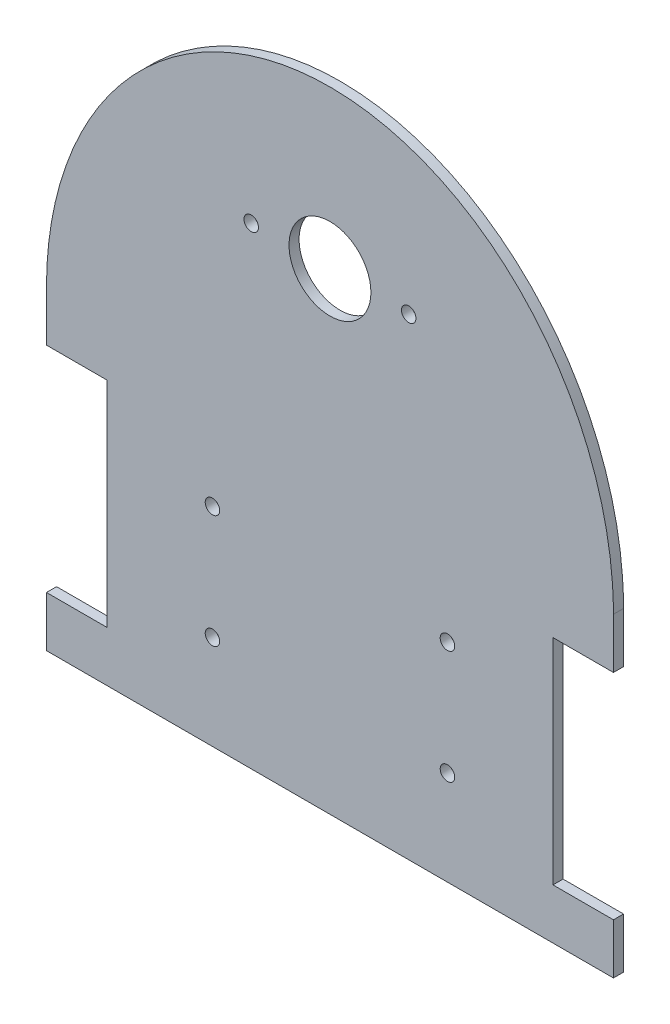
ISO-10303-21;
HEADER;
FILE_DESCRIPTION(('STEP AP214'),'2;1');
FILE_NAME('part.step','',(''),(''),'','','');
FILE_SCHEMA(('AUTOMOTIVE_DESIGN { 1 0 10303 214 1 1 1 1 }'));
ENDSEC;
DATA;
#1=APPLICATION_CONTEXT('core data for automotive mechanical design processes');
#2=APPLICATION_PROTOCOL_DEFINITION('international standard','automotive_design',2000,#1);
#3=PRODUCT_CONTEXT('',#1,'mechanical');
#4=PRODUCT('Part','Part','',(#3));
#5=PRODUCT_RELATED_PRODUCT_CATEGORY('part','',(#4));
#6=PRODUCT_DEFINITION_FORMATION('','',#4);
#7=PRODUCT_DEFINITION_CONTEXT('part definition',#1,'design');
#8=PRODUCT_DEFINITION('design','',#6,#7);
#9=PRODUCT_DEFINITION_SHAPE('','',#8);
#10=(LENGTH_UNIT() NAMED_UNIT(*) SI_UNIT(.MILLI.,.METRE.));
#11=(NAMED_UNIT(*) PLANE_ANGLE_UNIT() SI_UNIT($,.RADIAN.));
#12=(NAMED_UNIT(*) SI_UNIT($,.STERADIAN.) SOLID_ANGLE_UNIT());
#13=UNCERTAINTY_MEASURE_WITH_UNIT(LENGTH_MEASURE(1.E-05),#10,'distance_accuracy_value','');
#14=(GEOMETRIC_REPRESENTATION_CONTEXT(3) GLOBAL_UNCERTAINTY_ASSIGNED_CONTEXT((#13)) GLOBAL_UNIT_ASSIGNED_CONTEXT((#10,
#11,#12)) REPRESENTATION_CONTEXT('',''));
#15=CARTESIAN_POINT('',(0.,0.,0.));
#16=DIRECTION('',(0.,0.,1.));
#17=DIRECTION('',(1.,0.,0.));
#18=AXIS2_PLACEMENT_3D('',#15,#16,#17);
#19=CARTESIAN_POINT('',(-45.,-50.,1.6));
#20=DIRECTION('',(1.,0.,0.));
#21=DIRECTION('',(0.,0.,-1.));
#22=AXIS2_PLACEMENT_3D('',#19,#20,#21);
#23=PLANE('',#22);
#24=DIRECTION('',(0.,-1.,0.));
#25=VECTOR('',#24,1.);
#26=CARTESIAN_POINT('',(-45.,-50.,0.));
#27=LINE('',#26,#25);
#28=CARTESIAN_POINT('',(-45.,0.,0.));
#29=VERTEX_POINT('',#28);
#30=CARTESIAN_POINT('',(-45.,-7.99999999999999,0.));
#31=VERTEX_POINT('',#30);
#32=EDGE_CURVE('E235',#29,#31,#27,.T.);
#33=ORIENTED_EDGE('',*,*,#32,.T.);
#34=DIRECTION('',(0.,0.,1.));
#35=VECTOR('',#34,1.);
#36=CARTESIAN_POINT('',(-45.,-7.99999999999999,0.));
#37=LINE('',#36,#35);
#38=CARTESIAN_POINT('',(-45.,-7.99999999999999,1.6));
#39=VERTEX_POINT('',#38);
#40=EDGE_CURVE('E167',#31,#39,#37,.T.);
#41=ORIENTED_EDGE('',*,*,#40,.T.);
#42=DIRECTION('',(0.,-1.,0.));
#43=VECTOR('',#42,1.);
#44=CARTESIAN_POINT('',(-45.,-50.,1.6));
#45=LINE('',#44,#43);
#46=CARTESIAN_POINT('',(-45.,0.,1.6));
#47=VERTEX_POINT('',#46);
#48=EDGE_CURVE('E271',#47,#39,#45,.T.);
#49=ORIENTED_EDGE('',*,*,#48,.F.);
#50=DIRECTION('',(0.,0.,1.));
#51=VECTOR('',#50,1.);
#52=CARTESIAN_POINT('',(-45.,0.,0.));
#53=LINE('',#52,#51);
#54=EDGE_CURVE('E238',#29,#47,#53,.T.);
#55=ORIENTED_EDGE('',*,*,#54,.F.);
#56=EDGE_LOOP('',(#33,#41,#49,#55));
#57=FACE_BOUND('',#56,.T.);
#58=ADVANCED_FACE('F45',(#57),#23,.F.);
#59=CARTESIAN_POINT('',(45.,-50.,1.6));
#60=DIRECTION('',(-1.,0.,0.));
#61=DIRECTION('',(0.,0.,1.));
#62=AXIS2_PLACEMENT_3D('',#59,#60,#61);
#63=PLANE('',#62);
#64=DIRECTION('',(0.,1.,0.));
#65=VECTOR('',#64,1.);
#66=CARTESIAN_POINT('',(45.,-50.,0.));
#67=LINE('',#66,#65);
#68=CARTESIAN_POINT('',(45.,-50.,0.));
#69=VERTEX_POINT('',#68);
#70=CARTESIAN_POINT('',(45.,-42.,0.));
#71=VERTEX_POINT('',#70);
#72=EDGE_CURVE('E248',#69,#71,#67,.T.);
#73=ORIENTED_EDGE('',*,*,#72,.T.);
#74=DIRECTION('',(0.,0.,1.));
#75=VECTOR('',#74,1.);
#76=CARTESIAN_POINT('',(45.,-42.,0.));
#77=LINE('',#76,#75);
#78=CARTESIAN_POINT('',(45.,-42.,1.6));
#79=VERTEX_POINT('',#78);
#80=EDGE_CURVE('E180',#71,#79,#77,.T.);
#81=ORIENTED_EDGE('',*,*,#80,.T.);
#82=DIRECTION('',(0.,1.,0.));
#83=VECTOR('',#82,1.);
#84=CARTESIAN_POINT('',(45.,-50.,1.6));
#85=LINE('',#84,#83);
#86=CARTESIAN_POINT('',(45.,-50.,1.6));
#87=VERTEX_POINT('',#86);
#88=EDGE_CURVE('E245',#87,#79,#85,.T.);
#89=ORIENTED_EDGE('',*,*,#88,.F.);
#90=DIRECTION('',(0.,0.,-1.));
#91=VECTOR('',#90,1.);
#92=CARTESIAN_POINT('',(45.,-50.,1.6));
#93=LINE('',#92,#91);
#94=EDGE_CURVE('E252',#87,#69,#93,.T.);
#95=ORIENTED_EDGE('',*,*,#94,.T.);
#96=EDGE_LOOP('',(#73,#81,#89,#95));
#97=FACE_BOUND('',#96,.T.);
#98=ADVANCED_FACE('F212',(#97),#63,.F.);
#99=CARTESIAN_POINT('',(0.,0.,1.6));
#100=DIRECTION('',(0.,0.,1.));
#101=DIRECTION('',(1.,0.,0.));
#102=AXIS2_PLACEMENT_3D('',#99,#100,#101);
#103=PLANE('',#102);
#104=CARTESIAN_POINT('',(-12.5,25.,1.6));
#105=DIRECTION('',(0.,0.,1.));
#106=DIRECTION('',(1.,0.,0.));
#107=AXIS2_PLACEMENT_3D('',#104,#105,#106);
#108=CIRCLE('',#107,1.15);
#109=CARTESIAN_POINT('',(-11.35,25.,1.6));
#110=VERTEX_POINT('',#109);
#111=EDGE_CURVE('E333',#110,#110,#108,.T.);
#112=ORIENTED_EDGE('',*,*,#111,.F.);
#113=EDGE_LOOP('',(#112));
#114=FACE_BOUND('',#113,.T.);
#115=CARTESIAN_POINT('',(12.5,25.,1.6));
#116=DIRECTION('',(0.,0.,1.));
#117=DIRECTION('',(1.,0.,0.));
#118=AXIS2_PLACEMENT_3D('',#115,#116,#117);
#119=CIRCLE('',#118,1.15);
#120=CARTESIAN_POINT('',(13.65,25.,1.6));
#121=VERTEX_POINT('',#120);
#122=EDGE_CURVE('E334',#121,#121,#119,.T.);
#123=ORIENTED_EDGE('',*,*,#122,.F.);
#124=EDGE_LOOP('',(#123));
#125=FACE_BOUND('',#124,.T.);
#126=CARTESIAN_POINT('',(18.65,-17.,1.6));
#127=DIRECTION('',(0.,0.,1.));
#128=DIRECTION('',(-1.,0.,0.));
#129=AXIS2_PLACEMENT_3D('',#126,#127,#128);
#130=CIRCLE('',#129,1.15);
#131=CARTESIAN_POINT('',(17.5,-17.,1.6));
#132=VERTEX_POINT('',#131);
#133=EDGE_CURVE('E357',#132,#132,#130,.T.);
#134=ORIENTED_EDGE('',*,*,#133,.F.);
#135=EDGE_LOOP('',(#134));
#136=FACE_BOUND('',#135,.T.);
#137=CARTESIAN_POINT('',(18.65,-35.,1.6));
#138=DIRECTION('',(0.,0.,1.));
#139=DIRECTION('',(-1.,0.,0.));
#140=AXIS2_PLACEMENT_3D('',#137,#138,#139);
#141=CIRCLE('',#140,1.15);
#142=CARTESIAN_POINT('',(17.5,-35.,1.6));
#143=VERTEX_POINT('',#142);
#144=EDGE_CURVE('E351',#143,#143,#141,.T.);
#145=ORIENTED_EDGE('',*,*,#144,.F.);
#146=EDGE_LOOP('',(#145));
#147=FACE_BOUND('',#146,.T.);
#148=CARTESIAN_POINT('',(-18.65,-35.,1.6));
#149=DIRECTION('',(0.,0.,1.));
#150=DIRECTION('',(1.,0.,0.));
#151=AXIS2_PLACEMENT_3D('',#148,#149,#150);
#152=CIRCLE('',#151,1.15);
#153=CARTESIAN_POINT('',(-17.5,-35.,1.6));
#154=VERTEX_POINT('',#153);
#155=EDGE_CURVE('E344',#154,#154,#152,.T.);
#156=ORIENTED_EDGE('',*,*,#155,.F.);
#157=EDGE_LOOP('',(#156));
#158=FACE_BOUND('',#157,.T.);
#159=CARTESIAN_POINT('',(-18.65,-17.,1.6));
#160=DIRECTION('',(0.,0.,1.));
#161=DIRECTION('',(1.,0.,0.));
#162=AXIS2_PLACEMENT_3D('',#159,#160,#161);
#163=CIRCLE('',#162,1.15);
#164=CARTESIAN_POINT('',(-17.5,-17.,1.6));
#165=VERTEX_POINT('',#164);
#166=EDGE_CURVE('E347',#165,#165,#163,.T.);
#167=ORIENTED_EDGE('',*,*,#166,.F.);
#168=EDGE_LOOP('',(#167));
#169=FACE_BOUND('',#168,.T.);
#170=CARTESIAN_POINT('',(0.,25.,1.6));
#171=DIRECTION('',(0.,0.,1.));
#172=DIRECTION('',(1.,0.,0.));
#173=AXIS2_PLACEMENT_3D('',#170,#171,#172);
#174=CIRCLE('',#173,6.5);
#175=CARTESIAN_POINT('',(6.5,25.,1.6));
#176=VERTEX_POINT('',#175);
#177=EDGE_CURVE('E160',#176,#176,#174,.T.);
#178=ORIENTED_EDGE('',*,*,#177,.F.);
#179=EDGE_LOOP('',(#178));
#180=FACE_BOUND('',#179,.T.);
#181=DIRECTION('',(-1.,0.,0.));
#182=VECTOR('',#181,1.);
#183=CARTESIAN_POINT('',(-45.,-7.99999999999999,1.6));
#184=LINE('',#183,#182);
#185=CARTESIAN_POINT('',(-35.4,-7.99999999999999,1.6));
#186=VERTEX_POINT('',#185);
#187=EDGE_CURVE('E155',#186,#39,#184,.T.);
#188=ORIENTED_EDGE('',*,*,#187,.F.);
#189=DIRECTION('',(0.,1.,0.));
#190=VECTOR('',#189,1.);
#191=CARTESIAN_POINT('',(-35.4,-7.99999999999999,1.6));
#192=LINE('',#191,#190);
#193=CARTESIAN_POINT('',(-35.4,-42.,1.6));
#194=VERTEX_POINT('',#193);
#195=EDGE_CURVE('E157',#194,#186,#192,.T.);
#196=ORIENTED_EDGE('',*,*,#195,.F.);
#197=DIRECTION('',(1.,0.,0.));
#198=VECTOR('',#197,1.);
#199=CARTESIAN_POINT('',(-45.,-42.,1.6));
#200=LINE('',#199,#198);
#201=CARTESIAN_POINT('',(-45.,-42.,1.6));
#202=VERTEX_POINT('',#201);
#203=EDGE_CURVE('E136',#202,#194,#200,.T.);
#204=ORIENTED_EDGE('',*,*,#203,.F.);
#205=CARTESIAN_POINT('',(-45.,-50.,1.6));
#206=VERTEX_POINT('',#205);
#207=EDGE_CURVE('E251',#202,#206,#45,.T.);
#208=ORIENTED_EDGE('',*,*,#207,.T.);
#209=DIRECTION('',(1.,0.,0.));
#210=VECTOR('',#209,1.);
#211=CARTESIAN_POINT('',(45.,-50.,1.6));
#212=LINE('',#211,#210);
#213=EDGE_CURVE('E258',#206,#87,#212,.T.);
#214=ORIENTED_EDGE('',*,*,#213,.T.);
#215=ORIENTED_EDGE('',*,*,#88,.T.);
#216=DIRECTION('',(1.,0.,0.));
#217=VECTOR('',#216,1.);
#218=CARTESIAN_POINT('',(45.,-42.,1.6));
#219=LINE('',#218,#217);
#220=CARTESIAN_POINT('',(35.4,-42.,1.6));
#221=VERTEX_POINT('',#220);
#222=EDGE_CURVE('E184',#221,#79,#219,.T.);
#223=ORIENTED_EDGE('',*,*,#222,.F.);
#224=DIRECTION('',(0.,-1.,0.));
#225=VECTOR('',#224,1.);
#226=CARTESIAN_POINT('',(35.4,-7.99999999999999,1.6));
#227=LINE('',#226,#225);
#228=CARTESIAN_POINT('',(35.4,-7.99999999999999,1.6));
#229=VERTEX_POINT('',#228);
#230=EDGE_CURVE('E186',#229,#221,#227,.T.);
#231=ORIENTED_EDGE('',*,*,#230,.F.);
#232=DIRECTION('',(-1.,0.,0.));
#233=VECTOR('',#232,1.);
#234=CARTESIAN_POINT('',(45.,-7.99999999999999,1.6));
#235=LINE('',#234,#233);
#236=CARTESIAN_POINT('',(45.,-7.99999999999999,1.6));
#237=VERTEX_POINT('',#236);
#238=EDGE_CURVE('E165',#237,#229,#235,.T.);
#239=ORIENTED_EDGE('',*,*,#238,.F.);
#240=CARTESIAN_POINT('',(45.,0.,1.6));
#241=VERTEX_POINT('',#240);
#242=EDGE_CURVE('E266',#237,#241,#85,.T.);
#243=ORIENTED_EDGE('',*,*,#242,.T.);
#244=CARTESIAN_POINT('',(0.,0.,1.6));
#245=DIRECTION('',(0.,0.,-1.));
#246=DIRECTION('',(0.,-1.,0.));
#247=AXIS2_PLACEMENT_3D('',#244,#245,#246);
#248=ELLIPSE('',#247,50.,45.);
#249=EDGE_CURVE('E170',#47,#241,#248,.T.);
#250=ORIENTED_EDGE('',*,*,#249,.F.);
#251=ORIENTED_EDGE('',*,*,#48,.T.);
#252=EDGE_LOOP('',(#188,#196,#204,#208,#214,#215,#223,#231,#239,#243,#250,#251));
#253=FACE_BOUND('',#252,.T.);
#254=ADVANCED_FACE('F209',(#114,#125,#136,#147,#158,#169,#180,#253),#103,.T.);
#255=CARTESIAN_POINT('',(0.,0.,0.));
#256=DIRECTION('',(0.,0.,1.));
#257=DIRECTION('',(1.,0.,0.));
#258=AXIS2_PLACEMENT_3D('',#255,#256,#257);
#259=PLANE('',#258);
#260=CARTESIAN_POINT('',(-12.5,25.,0.));
#261=DIRECTION('',(0.,0.,1.));
#262=DIRECTION('',(1.,0.,0.));
#263=AXIS2_PLACEMENT_3D('',#260,#261,#262);
#264=CIRCLE('',#263,1.15);
#265=CARTESIAN_POINT('',(-11.35,25.,0.));
#266=VERTEX_POINT('',#265);
#267=EDGE_CURVE('E330',#266,#266,#264,.T.);
#268=ORIENTED_EDGE('',*,*,#267,.T.);
#269=EDGE_LOOP('',(#268));
#270=FACE_BOUND('',#269,.T.);
#271=CARTESIAN_POINT('',(12.5,25.,0.));
#272=DIRECTION('',(0.,0.,1.));
#273=DIRECTION('',(1.,0.,0.));
#274=AXIS2_PLACEMENT_3D('',#271,#272,#273);
#275=CIRCLE('',#274,1.15);
#276=CARTESIAN_POINT('',(13.65,25.,0.));
#277=VERTEX_POINT('',#276);
#278=EDGE_CURVE('E339',#277,#277,#275,.T.);
#279=ORIENTED_EDGE('',*,*,#278,.T.);
#280=EDGE_LOOP('',(#279));
#281=FACE_BOUND('',#280,.T.);
#282=CARTESIAN_POINT('',(18.65,-17.,0.));
#283=DIRECTION('',(0.,0.,1.));
#284=DIRECTION('',(-1.,0.,0.));
#285=AXIS2_PLACEMENT_3D('',#282,#283,#284);
#286=CIRCLE('',#285,1.15);
#287=CARTESIAN_POINT('',(17.5,-17.,0.));
#288=VERTEX_POINT('',#287);
#289=EDGE_CURVE('E336',#288,#288,#286,.T.);
#290=ORIENTED_EDGE('',*,*,#289,.T.);
#291=EDGE_LOOP('',(#290));
#292=FACE_BOUND('',#291,.T.);
#293=CARTESIAN_POINT('',(18.65,-35.,0.));
#294=DIRECTION('',(0.,0.,1.));
#295=DIRECTION('',(-1.,0.,0.));
#296=AXIS2_PLACEMENT_3D('',#293,#294,#295);
#297=CIRCLE('',#296,1.15);
#298=CARTESIAN_POINT('',(17.5,-35.,0.));
#299=VERTEX_POINT('',#298);
#300=EDGE_CURVE('E354',#299,#299,#297,.T.);
#301=ORIENTED_EDGE('',*,*,#300,.T.);
#302=EDGE_LOOP('',(#301));
#303=FACE_BOUND('',#302,.T.);
#304=CARTESIAN_POINT('',(-18.65,-35.,0.));
#305=DIRECTION('',(0.,0.,1.));
#306=DIRECTION('',(1.,0.,0.));
#307=AXIS2_PLACEMENT_3D('',#304,#305,#306);
#308=CIRCLE('',#307,1.15);
#309=CARTESIAN_POINT('',(-17.5,-35.,0.));
#310=VERTEX_POINT('',#309);
#311=EDGE_CURVE('E348',#310,#310,#308,.T.);
#312=ORIENTED_EDGE('',*,*,#311,.T.);
#313=EDGE_LOOP('',(#312));
#314=FACE_BOUND('',#313,.T.);
#315=CARTESIAN_POINT('',(-18.65,-17.,0.));
#316=DIRECTION('',(0.,0.,1.));
#317=DIRECTION('',(1.,0.,0.));
#318=AXIS2_PLACEMENT_3D('',#315,#316,#317);
#319=CIRCLE('',#318,1.15);
#320=CARTESIAN_POINT('',(-17.5,-17.,0.));
#321=VERTEX_POINT('',#320);
#322=EDGE_CURVE('E362',#321,#321,#319,.T.);
#323=ORIENTED_EDGE('',*,*,#322,.T.);
#324=EDGE_LOOP('',(#323));
#325=FACE_BOUND('',#324,.T.);
#326=CARTESIAN_POINT('',(0.,25.,0.));
#327=DIRECTION('',(0.,0.,1.));
#328=DIRECTION('',(1.,0.,0.));
#329=AXIS2_PLACEMENT_3D('',#326,#327,#328);
#330=CIRCLE('',#329,6.5);
#331=CARTESIAN_POINT('',(6.5,25.,0.));
#332=VERTEX_POINT('',#331);
#333=EDGE_CURVE('E183',#332,#332,#330,.T.);
#334=ORIENTED_EDGE('',*,*,#333,.T.);
#335=EDGE_LOOP('',(#334));
#336=FACE_BOUND('',#335,.T.);
#337=DIRECTION('',(0.,1.,0.));
#338=VECTOR('',#337,1.);
#339=CARTESIAN_POINT('',(-35.4,-7.99999999999999,0.));
#340=LINE('',#339,#338);
#341=CARTESIAN_POINT('',(-35.4,-42.,0.));
#342=VERTEX_POINT('',#341);
#343=CARTESIAN_POINT('',(-35.4,-7.99999999999999,0.));
#344=VERTEX_POINT('',#343);
#345=EDGE_CURVE('E144',#342,#344,#340,.T.);
#346=ORIENTED_EDGE('',*,*,#345,.T.);
#347=DIRECTION('',(-1.,0.,0.));
#348=VECTOR('',#347,1.);
#349=CARTESIAN_POINT('',(-45.,-7.99999999999999,0.));
#350=LINE('',#349,#348);
#351=EDGE_CURVE('E149',#344,#31,#350,.T.);
#352=ORIENTED_EDGE('',*,*,#351,.T.);
#353=ORIENTED_EDGE('',*,*,#32,.F.);
#354=CARTESIAN_POINT('',(0.,0.,0.));
#355=DIRECTION('',(0.,0.,-1.));
#356=DIRECTION('',(0.,-1.,0.));
#357=AXIS2_PLACEMENT_3D('',#354,#355,#356);
#358=ELLIPSE('',#357,50.,45.);
#359=CARTESIAN_POINT('',(45.,0.,0.));
#360=VERTEX_POINT('',#359);
#361=EDGE_CURVE('E11',#29,#360,#358,.T.);
#362=ORIENTED_EDGE('',*,*,#361,.T.);
#363=CARTESIAN_POINT('',(45.,-7.99999999999999,0.));
#364=VERTEX_POINT('',#363);
#365=EDGE_CURVE('E241',#364,#360,#67,.T.);
#366=ORIENTED_EDGE('',*,*,#365,.F.);
#367=DIRECTION('',(-1.,0.,0.));
#368=VECTOR('',#367,1.);
#369=CARTESIAN_POINT('',(45.,-7.99999999999999,0.));
#370=LINE('',#369,#368);
#371=CARTESIAN_POINT('',(35.4,-7.99999999999999,0.));
#372=VERTEX_POINT('',#371);
#373=EDGE_CURVE('E68',#364,#372,#370,.T.);
#374=ORIENTED_EDGE('',*,*,#373,.T.);
#375=DIRECTION('',(0.,-1.,0.));
#376=VECTOR('',#375,1.);
#377=CARTESIAN_POINT('',(35.4,-7.99999999999999,0.));
#378=LINE('',#377,#376);
#379=CARTESIAN_POINT('',(35.4,-42.,0.));
#380=VERTEX_POINT('',#379);
#381=EDGE_CURVE('E193',#372,#380,#378,.T.);
#382=ORIENTED_EDGE('',*,*,#381,.T.);
#383=DIRECTION('',(1.,0.,0.));
#384=VECTOR('',#383,1.);
#385=CARTESIAN_POINT('',(45.,-42.,0.));
#386=LINE('',#385,#384);
#387=EDGE_CURVE('E175',#380,#71,#386,.T.);
#388=ORIENTED_EDGE('',*,*,#387,.T.);
#389=ORIENTED_EDGE('',*,*,#72,.F.);
#390=DIRECTION('',(1.,0.,0.));
#391=VECTOR('',#390,1.);
#392=CARTESIAN_POINT('',(45.,-50.,0.));
#393=LINE('',#392,#391);
#394=CARTESIAN_POINT('',(-45.,-50.,0.));
#395=VERTEX_POINT('',#394);
#396=EDGE_CURVE('E239',#395,#69,#393,.T.);
#397=ORIENTED_EDGE('',*,*,#396,.F.);
#398=CARTESIAN_POINT('',(-45.,-42.,0.));
#399=VERTEX_POINT('',#398);
#400=EDGE_CURVE('E154',#399,#395,#27,.T.);
#401=ORIENTED_EDGE('',*,*,#400,.F.);
#402=DIRECTION('',(1.,0.,0.));
#403=VECTOR('',#402,1.);
#404=CARTESIAN_POINT('',(-45.,-42.,0.));
#405=LINE('',#404,#403);
#406=EDGE_CURVE('E60',#399,#342,#405,.T.);
#407=ORIENTED_EDGE('',*,*,#406,.T.);
#408=EDGE_LOOP('',(#346,#352,#353,#362,#366,#374,#382,#388,#389,#397,#401,#407));
#409=FACE_BOUND('',#408,.T.);
#410=ADVANCED_FACE('F152',(#270,#281,#292,#303,#314,#325,#336,#409),#259,.F.);
#411=ORIENTED_EDGE('',*,*,#207,.F.);
#412=DIRECTION('',(0.,0.,1.));
#413=VECTOR('',#412,1.);
#414=CARTESIAN_POINT('',(-45.,-42.,0.));
#415=LINE('',#414,#413);
#416=EDGE_CURVE('E141',#399,#202,#415,.T.);
#417=ORIENTED_EDGE('',*,*,#416,.F.);
#418=ORIENTED_EDGE('',*,*,#400,.T.);
#419=DIRECTION('',(0.,0.,-1.));
#420=VECTOR('',#419,1.);
#421=CARTESIAN_POINT('',(-45.,-50.,1.6));
#422=LINE('',#421,#420);
#423=EDGE_CURVE('E53',#206,#395,#422,.T.);
#424=ORIENTED_EDGE('',*,*,#423,.F.);
#425=EDGE_LOOP('',(#411,#417,#418,#424));
#426=FACE_BOUND('',#425,.T.);
#427=ADVANCED_FACE('F47',(#426),#23,.F.);
#428=CARTESIAN_POINT('',(45.,-50.,1.6));
#429=DIRECTION('',(0.,1.,0.));
#430=DIRECTION('',(-1.,0.,0.));
#431=AXIS2_PLACEMENT_3D('',#428,#429,#430);
#432=PLANE('',#431);
#433=ORIENTED_EDGE('',*,*,#396,.T.);
#434=ORIENTED_EDGE('',*,*,#94,.F.);
#435=ORIENTED_EDGE('',*,*,#213,.F.);
#436=ORIENTED_EDGE('',*,*,#423,.T.);
#437=EDGE_LOOP('',(#433,#434,#435,#436));
#438=FACE_BOUND('',#437,.T.);
#439=ADVANCED_FACE('F218',(#438),#432,.F.);
#440=ORIENTED_EDGE('',*,*,#242,.F.);
#441=DIRECTION('',(0.,0.,1.));
#442=VECTOR('',#441,1.);
#443=CARTESIAN_POINT('',(45.,-7.99999999999999,0.));
#444=LINE('',#443,#442);
#445=EDGE_CURVE('E173',#364,#237,#444,.T.);
#446=ORIENTED_EDGE('',*,*,#445,.F.);
#447=ORIENTED_EDGE('',*,*,#365,.T.);
#448=DIRECTION('',(0.,0.,1.));
#449=VECTOR('',#448,1.);
#450=CARTESIAN_POINT('',(45.,0.,0.));
#451=LINE('',#450,#449);
#452=EDGE_CURVE('E243',#360,#241,#451,.T.);
#453=ORIENTED_EDGE('',*,*,#452,.T.);
#454=EDGE_LOOP('',(#440,#446,#447,#453));
#455=FACE_BOUND('',#454,.T.);
#456=ADVANCED_FACE('F206',(#455),#63,.F.);
#457=CARTESIAN_POINT('',(0.,0.,0.));
#458=DIRECTION('',(0.,0.,-1.));
#459=DIRECTION('',(0.,-1.,0.));
#460=AXIS2_PLACEMENT_3D('',#457,#458,#459);
#461=ELLIPSE('',#460,50.,45.);
#462=DIRECTION('',(0.,0.,1.));
#463=VECTOR('',#462,1.);
#464=SURFACE_OF_LINEAR_EXTRUSION('',#461,#463);
#465=ORIENTED_EDGE('',*,*,#361,.F.);
#466=ORIENTED_EDGE('',*,*,#54,.T.);
#467=ORIENTED_EDGE('',*,*,#249,.T.);
#468=ORIENTED_EDGE('',*,*,#452,.F.);
#469=EDGE_LOOP('',(#465,#466,#467,#468));
#470=FACE_BOUND('',#469,.T.);
#471=ADVANCED_FACE('F201',(#470),#464,.F.);
#472=CARTESIAN_POINT('',(45.,-42.,0.));
#473=DIRECTION('',(0.,-1.,0.));
#474=DIRECTION('',(0.,0.,-1.));
#475=AXIS2_PLACEMENT_3D('',#472,#473,#474);
#476=PLANE('',#475);
#477=ORIENTED_EDGE('',*,*,#222,.T.);
#478=ORIENTED_EDGE('',*,*,#80,.F.);
#479=ORIENTED_EDGE('',*,*,#387,.F.);
#480=DIRECTION('',(0.,0.,1.));
#481=VECTOR('',#480,1.);
#482=CARTESIAN_POINT('',(35.4,-42.,0.));
#483=LINE('',#482,#481);
#484=EDGE_CURVE('E178',#380,#221,#483,.T.);
#485=ORIENTED_EDGE('',*,*,#484,.T.);
#486=EDGE_LOOP('',(#477,#478,#479,#485));
#487=FACE_BOUND('',#486,.T.);
#488=ADVANCED_FACE('F205',(#487),#476,.F.);
#489=CARTESIAN_POINT('',(35.4,-7.99999999999999,0.));
#490=DIRECTION('',(-1.,0.,0.));
#491=DIRECTION('',(0.,-1.,0.));
#492=AXIS2_PLACEMENT_3D('',#489,#490,#491);
#493=PLANE('',#492);
#494=ORIENTED_EDGE('',*,*,#230,.T.);
#495=ORIENTED_EDGE('',*,*,#484,.F.);
#496=ORIENTED_EDGE('',*,*,#381,.F.);
#497=DIRECTION('',(0.,0.,1.));
#498=VECTOR('',#497,1.);
#499=CARTESIAN_POINT('',(35.4,-7.99999999999999,0.));
#500=LINE('',#499,#498);
#501=EDGE_CURVE('E176',#372,#229,#500,.T.);
#502=ORIENTED_EDGE('',*,*,#501,.T.);
#503=EDGE_LOOP('',(#494,#495,#496,#502));
#504=FACE_BOUND('',#503,.T.);
#505=ADVANCED_FACE('F279',(#504),#493,.F.);
#506=CARTESIAN_POINT('',(45.,-7.99999999999999,0.));
#507=DIRECTION('',(0.,1.,0.));
#508=DIRECTION('',(0.,0.,1.));
#509=AXIS2_PLACEMENT_3D('',#506,#507,#508);
#510=PLANE('',#509);
#511=ORIENTED_EDGE('',*,*,#238,.T.);
#512=ORIENTED_EDGE('',*,*,#501,.F.);
#513=ORIENTED_EDGE('',*,*,#373,.F.);
#514=ORIENTED_EDGE('',*,*,#445,.T.);
#515=EDGE_LOOP('',(#511,#512,#513,#514));
#516=FACE_BOUND('',#515,.T.);
#517=ADVANCED_FACE('F283',(#516),#510,.F.);
#518=CARTESIAN_POINT('',(-45.,-7.99999999999999,0.));
#519=DIRECTION('',(0.,1.,0.));
#520=DIRECTION('',(0.,0.,1.));
#521=AXIS2_PLACEMENT_3D('',#518,#519,#520);
#522=PLANE('',#521);
#523=ORIENTED_EDGE('',*,*,#187,.T.);
#524=ORIENTED_EDGE('',*,*,#40,.F.);
#525=ORIENTED_EDGE('',*,*,#351,.F.);
#526=DIRECTION('',(0.,0.,1.));
#527=VECTOR('',#526,1.);
#528=CARTESIAN_POINT('',(-35.4,-7.99999999999999,0.));
#529=LINE('',#528,#527);
#530=EDGE_CURVE('E140',#344,#186,#529,.T.);
#531=ORIENTED_EDGE('',*,*,#530,.T.);
#532=EDGE_LOOP('',(#523,#524,#525,#531));
#533=FACE_BOUND('',#532,.T.);
#534=ADVANCED_FACE('F285',(#533),#522,.F.);
#535=CARTESIAN_POINT('',(-35.4,-7.99999999999999,0.));
#536=DIRECTION('',(1.,0.,0.));
#537=DIRECTION('',(0.,1.,0.));
#538=AXIS2_PLACEMENT_3D('',#535,#536,#537);
#539=PLANE('',#538);
#540=ORIENTED_EDGE('',*,*,#195,.T.);
#541=ORIENTED_EDGE('',*,*,#530,.F.);
#542=ORIENTED_EDGE('',*,*,#345,.F.);
#543=DIRECTION('',(0.,0.,1.));
#544=VECTOR('',#543,1.);
#545=CARTESIAN_POINT('',(-35.4,-42.,0.));
#546=LINE('',#545,#544);
#547=EDGE_CURVE('E132',#342,#194,#546,.T.);
#548=ORIENTED_EDGE('',*,*,#547,.T.);
#549=EDGE_LOOP('',(#540,#541,#542,#548));
#550=FACE_BOUND('',#549,.T.);
#551=ADVANCED_FACE('F145',(#550),#539,.F.);
#552=CARTESIAN_POINT('',(-45.,-42.,0.));
#553=DIRECTION('',(0.,-1.,0.));
#554=DIRECTION('',(0.,0.,-1.));
#555=AXIS2_PLACEMENT_3D('',#552,#553,#554);
#556=PLANE('',#555);
#557=ORIENTED_EDGE('',*,*,#203,.T.);
#558=ORIENTED_EDGE('',*,*,#547,.F.);
#559=ORIENTED_EDGE('',*,*,#406,.F.);
#560=ORIENTED_EDGE('',*,*,#416,.T.);
#561=EDGE_LOOP('',(#557,#558,#559,#560));
#562=FACE_BOUND('',#561,.T.);
#563=ADVANCED_FACE('F134',(#562),#556,.F.);
#564=CARTESIAN_POINT('',(0.,25.,0.));
#565=DIRECTION('',(0.,0.,1.));
#566=DIRECTION('',(1.,0.,0.));
#567=AXIS2_PLACEMENT_3D('',#564,#565,#566);
#568=CYLINDRICAL_SURFACE('',#567,6.5);
#569=ORIENTED_EDGE('',*,*,#333,.F.);
#570=EDGE_LOOP('',(#569));
#571=FACE_BOUND('',#570,.T.);
#572=ORIENTED_EDGE('',*,*,#177,.T.);
#573=EDGE_LOOP('',(#572));
#574=FACE_BOUND('',#573,.T.);
#575=ADVANCED_FACE('F296',(#571,#574),#568,.F.);
#576=CARTESIAN_POINT('',(-18.65,-17.,0.));
#577=DIRECTION('',(0.,0.,1.));
#578=DIRECTION('',(1.,0.,0.));
#579=AXIS2_PLACEMENT_3D('',#576,#577,#578);
#580=CYLINDRICAL_SURFACE('',#579,1.15);
#581=ORIENTED_EDGE('',*,*,#322,.F.);
#582=EDGE_LOOP('',(#581));
#583=FACE_BOUND('',#582,.T.);
#584=ORIENTED_EDGE('',*,*,#166,.T.);
#585=EDGE_LOOP('',(#584));
#586=FACE_BOUND('',#585,.T.);
#587=ADVANCED_FACE('F301',(#583,#586),#580,.F.);
#588=CARTESIAN_POINT('',(-18.65,-35.,0.));
#589=DIRECTION('',(0.,0.,1.));
#590=DIRECTION('',(1.,0.,0.));
#591=AXIS2_PLACEMENT_3D('',#588,#589,#590);
#592=CYLINDRICAL_SURFACE('',#591,1.15);
#593=ORIENTED_EDGE('',*,*,#311,.F.);
#594=EDGE_LOOP('',(#593));
#595=FACE_BOUND('',#594,.T.);
#596=ORIENTED_EDGE('',*,*,#155,.T.);
#597=EDGE_LOOP('',(#596));
#598=FACE_BOUND('',#597,.T.);
#599=ADVANCED_FACE('F305',(#595,#598),#592,.F.);
#600=CARTESIAN_POINT('',(18.65,-35.,0.));
#601=DIRECTION('',(0.,0.,1.));
#602=DIRECTION('',(1.,0.,0.));
#603=AXIS2_PLACEMENT_3D('',#600,#601,#602);
#604=CYLINDRICAL_SURFACE('',#603,1.15);
#605=ORIENTED_EDGE('',*,*,#300,.F.);
#606=EDGE_LOOP('',(#605));
#607=FACE_BOUND('',#606,.T.);
#608=ORIENTED_EDGE('',*,*,#144,.T.);
#609=EDGE_LOOP('',(#608));
#610=FACE_BOUND('',#609,.T.);
#611=ADVANCED_FACE('F311',(#607,#610),#604,.F.);
#612=CARTESIAN_POINT('',(18.65,-17.,0.));
#613=DIRECTION('',(0.,0.,1.));
#614=DIRECTION('',(1.,0.,0.));
#615=AXIS2_PLACEMENT_3D('',#612,#613,#614);
#616=CYLINDRICAL_SURFACE('',#615,1.15);
#617=ORIENTED_EDGE('',*,*,#289,.F.);
#618=EDGE_LOOP('',(#617));
#619=FACE_BOUND('',#618,.T.);
#620=ORIENTED_EDGE('',*,*,#133,.T.);
#621=EDGE_LOOP('',(#620));
#622=FACE_BOUND('',#621,.T.);
#623=ADVANCED_FACE('F307',(#619,#622),#616,.F.);
#624=CARTESIAN_POINT('',(12.5,25.,0.));
#625=DIRECTION('',(0.,0.,1.));
#626=DIRECTION('',(1.,0.,0.));
#627=AXIS2_PLACEMENT_3D('',#624,#625,#626);
#628=CYLINDRICAL_SURFACE('',#627,1.15);
#629=ORIENTED_EDGE('',*,*,#278,.F.);
#630=EDGE_LOOP('',(#629));
#631=FACE_BOUND('',#630,.T.);
#632=ORIENTED_EDGE('',*,*,#122,.T.);
#633=EDGE_LOOP('',(#632));
#634=FACE_BOUND('',#633,.T.);
#635=ADVANCED_FACE('F310',(#631,#634),#628,.F.);
#636=CARTESIAN_POINT('',(-12.5,25.,0.));
#637=DIRECTION('',(0.,0.,1.));
#638=DIRECTION('',(1.,0.,0.));
#639=AXIS2_PLACEMENT_3D('',#636,#637,#638);
#640=CYLINDRICAL_SURFACE('',#639,1.15);
#641=ORIENTED_EDGE('',*,*,#267,.F.);
#642=EDGE_LOOP('',(#641));
#643=FACE_BOUND('',#642,.T.);
#644=ORIENTED_EDGE('',*,*,#111,.T.);
#645=EDGE_LOOP('',(#644));
#646=FACE_BOUND('',#645,.T.);
#647=ADVANCED_FACE('F321',(#643,#646),#640,.F.);
#648=CLOSED_SHELL('',(#58,#98,#254,#410,#427,#439,#456,#471,#488,#505,#517,#534,#551,#563,#575,
#587,#599,#611,#623,#635,#647));
#649=MANIFOLD_SOLID_BREP('B2',#648);
#650=ADVANCED_BREP_SHAPE_REPRESENTATION('',(#18,#649),#14);
#651=SHAPE_DEFINITION_REPRESENTATION(#9,#650);
ENDSEC;
END-ISO-10303-21;
